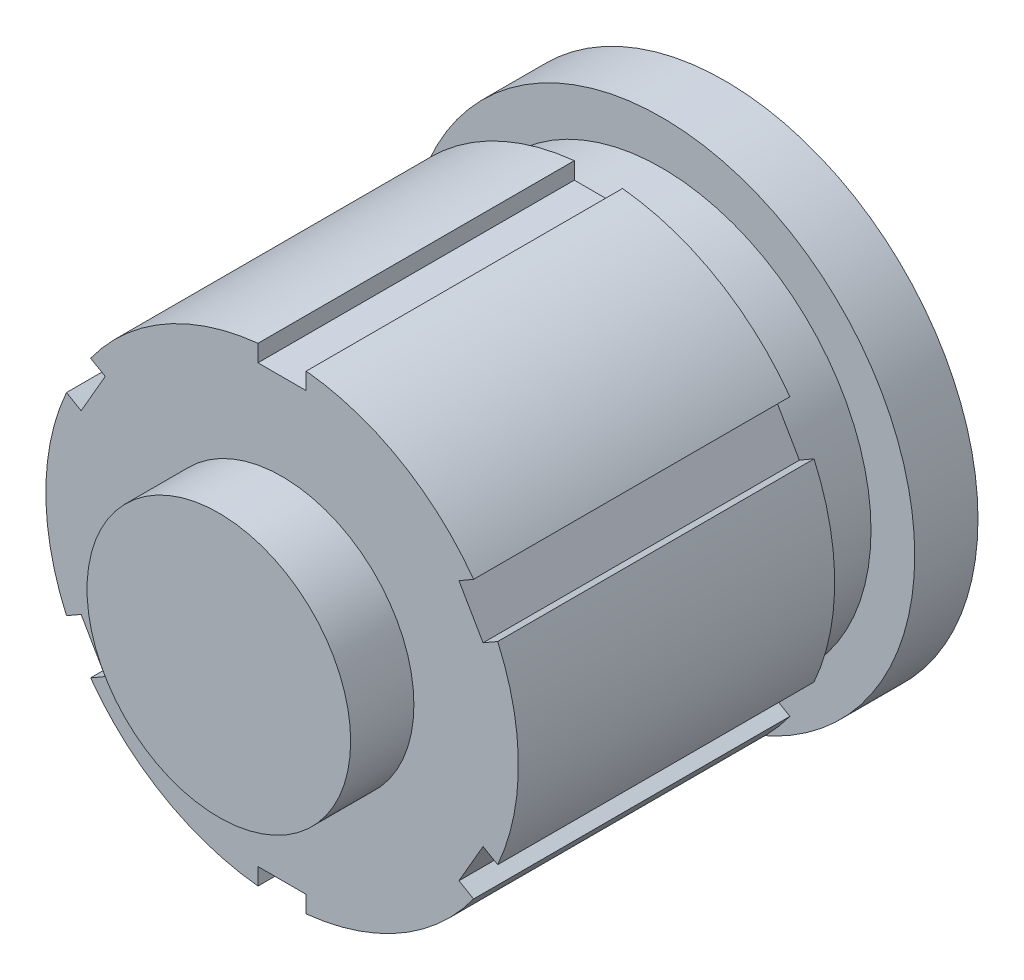
ISO-10303-21;
HEADER;
FILE_DESCRIPTION(('STEP AP214'),'2;1');
FILE_NAME('part.step','',(''),(''),'','','');
FILE_SCHEMA(('AUTOMOTIVE_DESIGN { 1 0 10303 214 1 1 1 1 }'));
ENDSEC;
DATA;
#1=APPLICATION_CONTEXT('core data for automotive mechanical design processes');
#2=APPLICATION_PROTOCOL_DEFINITION('international standard','automotive_design',2000,#1);
#3=PRODUCT_CONTEXT('',#1,'mechanical');
#4=PRODUCT('Part','Part','',(#3));
#5=PRODUCT_RELATED_PRODUCT_CATEGORY('part','',(#4));
#6=PRODUCT_DEFINITION_FORMATION('','',#4);
#7=PRODUCT_DEFINITION_CONTEXT('part definition',#1,'design');
#8=PRODUCT_DEFINITION('design','',#6,#7);
#9=PRODUCT_DEFINITION_SHAPE('','',#8);
#10=(LENGTH_UNIT() NAMED_UNIT(*) SI_UNIT(.MILLI.,.METRE.));
#11=(NAMED_UNIT(*) PLANE_ANGLE_UNIT() SI_UNIT($,.RADIAN.));
#12=(NAMED_UNIT(*) SI_UNIT($,.STERADIAN.) SOLID_ANGLE_UNIT());
#13=UNCERTAINTY_MEASURE_WITH_UNIT(LENGTH_MEASURE(1.E-05),#10,'distance_accuracy_value','');
#14=(GEOMETRIC_REPRESENTATION_CONTEXT(3) GLOBAL_UNCERTAINTY_ASSIGNED_CONTEXT((#13)) GLOBAL_UNIT_ASSIGNED_CONTEXT((#10,
#11,#12)) REPRESENTATION_CONTEXT('',''));
#15=CARTESIAN_POINT('',(0.,0.,0.));
#16=DIRECTION('',(0.,0.,1.));
#17=DIRECTION('',(1.,0.,0.));
#18=AXIS2_PLACEMENT_3D('',#15,#16,#17);
#19=CARTESIAN_POINT('',(0.,0.,35.));
#20=DIRECTION('',(0.,0.,1.));
#21=DIRECTION('',(1.,0.,0.));
#22=AXIS2_PLACEMENT_3D('',#19,#20,#21);
#23=PLANE('',#22);
#24=DIRECTION('',(0.866025403784439,-0.5,0.));
#25=VECTOR('',#24,1.);
#26=CARTESIAN_POINT('',(-0.952737771685016,-1.6501902268484,35.));
#27=LINE('',#26,#25);
#28=CARTESIAN_POINT('',(-17.0402573948478,7.63794355817802,35.));
#29=VERTEX_POINT('',#28);
#30=CARTESIAN_POINT('',(-15.8830303002571,6.96981818360254,35.));
#31=VERTEX_POINT('',#30);
#32=EDGE_CURVE('E11',#29,#31,#27,.T.);
#33=ORIENTED_EDGE('',*,*,#32,.F.);
#34=CARTESIAN_POINT('',(0.,0.,35.));
#35=DIRECTION('',(0.,0.,1.));
#36=DIRECTION('',(1.,0.,0.));
#37=AXIS2_PLACEMENT_3D('',#34,#35,#36);
#38=CIRCLE('',#37,18.6737396865378);
#39=CARTESIAN_POINT('',(-17.0402573948434,-7.63794355818781,35.));
#40=VERTEX_POINT('',#39);
#41=EDGE_CURVE('E365',#29,#40,#38,.T.);
#42=ORIENTED_EDGE('',*,*,#41,.T.);
#43=DIRECTION('',(-0.866025403784439,-0.5,0.));
#44=VECTOR('',#43,1.);
#45=CARTESIAN_POINT('',(-18.3663111475,-8.40354104924404,35.));
#46=LINE('',#45,#44);
#47=CARTESIAN_POINT('',(-15.8830303002522,-6.96981818361205,35.));
#48=VERTEX_POINT('',#47);
#49=EDGE_CURVE('E237',#48,#40,#46,.T.);
#50=ORIENTED_EDGE('',*,*,#49,.F.);
#51=DIRECTION('',(-0.5,0.866025403784438,0.));
#52=VECTOR('',#51,1.);
#53=CARTESIAN_POINT('',(-13.9775547568851,-10.2701986373038,35.));
#54=LINE('',#53,#52);
#55=CARTESIAN_POINT('',(-13.9775547568851,-10.2701986373038,35.));
#56=VERTEX_POINT('',#55);
#57=EDGE_CURVE('E58',#56,#48,#54,.T.);
#58=ORIENTED_EDGE('',*,*,#57,.F.);
#59=DIRECTION('',(0.866025403784439,0.5,0.));
#60=VECTOR('',#59,1.);
#61=CARTESIAN_POINT('',(0.952737771687454,-1.65019022685263,35.));
#62=LINE('',#61,#60);
#63=CARTESIAN_POINT('',(-15.1347818514749,-10.9383240118788,35.));
#64=VERTEX_POINT('',#63);
#65=EDGE_CURVE('E43',#64,#56,#62,.T.);
#66=ORIENTED_EDGE('',*,*,#65,.F.);
#67=CARTESIAN_POINT('',(-1.90547554335738,-18.5762675700541,35.));
#68=VERTEX_POINT('',#67);
#69=EDGE_CURVE('E438',#64,#68,#38,.T.);
#70=ORIENTED_EDGE('',*,*,#69,.T.);
#71=DIRECTION('',(0.,-1.,0.));
#72=VECTOR('',#71,1.);
#73=CARTESIAN_POINT('',(-1.90547554335738,-20.1074625521709,35.));
#74=LINE('',#73,#72);
#75=CARTESIAN_POINT('',(-1.90547554335738,-17.2400168209069,35.));
#76=VERTEX_POINT('',#75);
#77=EDGE_CURVE('E261',#76,#68,#74,.T.);
#78=ORIENTED_EDGE('',*,*,#77,.F.);
#79=DIRECTION('',(-1.,0.,0.));
#80=VECTOR('',#79,1.);
#81=CARTESIAN_POINT('',(1.90547554337688,-17.2400168209069,35.));
#82=LINE('',#81,#80);
#83=CARTESIAN_POINT('',(1.90547554337688,-17.2400168209069,35.));
#84=VERTEX_POINT('',#83);
#85=EDGE_CURVE('E256',#84,#76,#82,.T.);
#86=ORIENTED_EDGE('',*,*,#85,.F.);
#87=DIRECTION('',(0.,1.,0.));
#88=VECTOR('',#87,1.);
#89=CARTESIAN_POINT('',(1.90547554337689,0.,35.));
#90=LINE('',#89,#88);
#91=CARTESIAN_POINT('',(1.90547554337687,-18.5762675700521,35.));
#92=VERTEX_POINT('',#91);
#93=EDGE_CURVE('E387',#92,#84,#90,.T.);
#94=ORIENTED_EDGE('',*,*,#93,.F.);
#95=CARTESIAN_POINT('',(15.1347818514835,-10.9383240118669,35.));
#96=VERTEX_POINT('',#95);
#97=EDGE_CURVE('E434',#92,#96,#38,.T.);
#98=ORIENTED_EDGE('',*,*,#97,.T.);
#99=DIRECTION('',(0.866025403784439,-0.5,0.));
#100=VECTOR('',#99,1.);
#101=CARTESIAN_POINT('',(16.4608356041476,-11.7039215029274,35.));
#102=LINE('',#101,#100);
#103=CARTESIAN_POINT('',(13.9775547568997,-10.2701986372954,35.));
#104=VERTEX_POINT('',#103);
#105=EDGE_CURVE('E287',#104,#96,#102,.T.);
#106=ORIENTED_EDGE('',*,*,#105,.F.);
#107=DIRECTION('',(-0.5,-0.866025403784439,0.));
#108=VECTOR('',#107,1.);
#109=CARTESIAN_POINT('',(15.8830303002668,-6.96981818360361,35.));
#110=LINE('',#109,#108);
#111=CARTESIAN_POINT('',(15.8830303002668,-6.96981818360361,35.));
#112=VERTEX_POINT('',#111);
#113=EDGE_CURVE('E282',#112,#104,#110,.T.);
#114=ORIENTED_EDGE('',*,*,#113,.F.);
#115=DIRECTION('',(-0.866025403784438,0.5,0.));
#116=VECTOR('',#115,1.);
#117=CARTESIAN_POINT('',(0.952737771686994,1.65019022685183,35.));
#118=LINE('',#117,#116);
#119=CARTESIAN_POINT('',(17.0402573948494,-7.6379435581744,35.));
#120=VERTEX_POINT('',#119);
#121=EDGE_CURVE('E385',#120,#112,#118,.T.);
#122=ORIENTED_EDGE('',*,*,#121,.F.);
#123=CARTESIAN_POINT('',(17.0402573948458,7.63794355818249,35.));
#124=VERTEX_POINT('',#123);
#125=EDGE_CURVE('E433',#120,#124,#38,.T.);
#126=ORIENTED_EDGE('',*,*,#125,.T.);
#127=DIRECTION('',(0.866025403784439,0.5,0.));
#128=VECTOR('',#127,1.);
#129=CARTESIAN_POINT('',(18.3663111475098,8.40354104924297,35.));
#130=LINE('',#129,#128);
#131=CARTESIAN_POINT('',(15.883030300262,6.96981818361099,35.));
#132=VERTEX_POINT('',#131);
#133=EDGE_CURVE('E313',#132,#124,#130,.T.);
#134=ORIENTED_EDGE('',*,*,#133,.F.);
#135=DIRECTION('',(0.5,-0.866025403784439,0.));
#136=VECTOR('',#135,1.);
#137=CARTESIAN_POINT('',(13.9775547568948,10.2701986373028,35.));
#138=LINE('',#137,#136);
#139=CARTESIAN_POINT('',(13.9775547568948,10.2701986373028,35.));
#140=VERTEX_POINT('',#139);
#141=EDGE_CURVE('E308',#140,#132,#138,.T.);
#142=ORIENTED_EDGE('',*,*,#141,.F.);
#143=DIRECTION('',(-0.866025403784439,-0.5,0.));
#144=VECTOR('',#143,1.);
#145=CARTESIAN_POINT('',(-0.952737771684548,1.65019022684759,35.));
#146=LINE('',#145,#144);
#147=CARTESIAN_POINT('',(15.1347818514783,10.9383240118741,35.));
#148=VERTEX_POINT('',#147);
#149=EDGE_CURVE('E383',#148,#140,#146,.T.);
#150=ORIENTED_EDGE('',*,*,#149,.F.);
#151=CARTESIAN_POINT('',(1.90547554336714,18.5762675700531,35.));
#152=VERTEX_POINT('',#151);
#153=EDGE_CURVE('E366',#148,#152,#38,.T.);
#154=ORIENTED_EDGE('',*,*,#153,.T.);
#155=DIRECTION('',(0.,1.,0.));
#156=VECTOR('',#155,1.);
#157=CARTESIAN_POINT('',(1.90547554336714,20.1074625521698,35.));
#158=LINE('',#157,#156);
#159=CARTESIAN_POINT('',(1.90547554336714,17.2400168209058,35.));
#160=VERTEX_POINT('',#159);
#161=EDGE_CURVE('E334',#160,#152,#158,.T.);
#162=ORIENTED_EDGE('',*,*,#161,.F.);
#163=DIRECTION('',(1.,0.,0.));
#164=VECTOR('',#163,1.);
#165=CARTESIAN_POINT('',(-1.90547554336711,17.2400168209058,35.));
#166=LINE('',#165,#164);
#167=CARTESIAN_POINT('',(-1.90547554336711,17.2400168209058,35.));
#168=VERTEX_POINT('',#167);
#169=EDGE_CURVE('E339',#168,#160,#166,.T.);
#170=ORIENTED_EDGE('',*,*,#169,.F.);
#171=DIRECTION('',(0.,-1.,0.));
#172=VECTOR('',#171,1.);
#173=CARTESIAN_POINT('',(-1.90547554336713,0.,35.));
#174=LINE('',#173,#172);
#175=CARTESIAN_POINT('',(-1.90547554336711,18.5762675700531,35.));
#176=VERTEX_POINT('',#175);
#177=EDGE_CURVE('E379',#176,#168,#174,.T.);
#178=ORIENTED_EDGE('',*,*,#177,.F.);
#179=CARTESIAN_POINT('',(-15.1347818514812,10.9383240118701,35.));
#180=VERTEX_POINT('',#179);
#181=EDGE_CURVE('E361',#176,#180,#38,.T.);
#182=ORIENTED_EDGE('',*,*,#181,.T.);
#183=DIRECTION('',(-0.866025403784439,0.5,0.));
#184=VECTOR('',#183,1.);
#185=CARTESIAN_POINT('',(-16.4608356041378,11.7039215029263,35.));
#186=LINE('',#185,#184);
#187=CARTESIAN_POINT('',(-13.97755475689,10.2701986372943,35.));
#188=VERTEX_POINT('',#187);
#189=EDGE_CURVE('E218',#188,#180,#186,.T.);
#190=ORIENTED_EDGE('',*,*,#189,.F.);
#191=DIRECTION('',(0.5,0.866025403784439,0.));
#192=VECTOR('',#191,1.);
#193=CARTESIAN_POINT('',(-15.8830303002571,6.96981818360254,35.));
#194=LINE('',#193,#192);
#195=EDGE_CURVE('E50',#31,#188,#194,.T.);
#196=ORIENTED_EDGE('',*,*,#195,.F.);
#197=EDGE_LOOP('',(#33,#42,#50,#58,#66,#70,#78,#86,#94,#98,#106,#114,#122,#126,#134,#142,#150,
#154,#162,#170,#178,#182,#190,#196));
#198=FACE_BOUND('',#197,.T.);
#199=CARTESIAN_POINT('',(0.,0.,35.));
#200=DIRECTION('',(0.,0.,1.));
#201=DIRECTION('',(1.,0.,0.));
#202=AXIS2_PLACEMENT_3D('',#199,#200,#201);
#203=CIRCLE('',#202,10.4173741918093);
#204=CARTESIAN_POINT('',(10.4173741918093,0.,35.));
#205=VERTEX_POINT('',#204);
#206=EDGE_CURVE('E222',#205,#205,#203,.T.);
#207=ORIENTED_EDGE('',*,*,#206,.F.);
#208=EDGE_LOOP('',(#207));
#209=FACE_BOUND('',#208,.T.);
#210=ADVANCED_FACE('F35',(#198,#209),#23,.T.);
#211=CARTESIAN_POINT('',(0.,0.,35.));
#212=DIRECTION('',(0.,0.,-1.));
#213=DIRECTION('',(-1.,0.,0.));
#214=AXIS2_PLACEMENT_3D('',#211,#212,#213);
#215=CYLINDRICAL_SURFACE('',#214,18.6737396865378);
#216=ORIENTED_EDGE('',*,*,#41,.F.);
#217=DIRECTION('',(0.,0.,-1.));
#218=VECTOR('',#217,1.);
#219=CARTESIAN_POINT('',(-17.0402573948478,7.63794355817802,35.));
#220=LINE('',#219,#218);
#221=CARTESIAN_POINT('',(-17.0402573948478,7.63794355817802,10.));
#222=VERTEX_POINT('',#221);
#223=EDGE_CURVE('E230',#29,#222,#220,.T.);
#224=ORIENTED_EDGE('',*,*,#223,.T.);
#225=CARTESIAN_POINT('',(0.,0.,10.));
#226=DIRECTION('',(0.,0.,1.));
#227=DIRECTION('',(1.,0.,0.));
#228=AXIS2_PLACEMENT_3D('',#225,#226,#227);
#229=CIRCLE('',#228,18.6737396865378);
#230=CARTESIAN_POINT('',(-17.0402573948434,-7.63794355818782,10.));
#231=VERTEX_POINT('',#230);
#232=EDGE_CURVE('E369',#222,#231,#229,.T.);
#233=ORIENTED_EDGE('',*,*,#232,.T.);
#234=DIRECTION('',(0.,0.,-1.));
#235=VECTOR('',#234,1.);
#236=CARTESIAN_POINT('',(-17.0402573948434,-7.63794355818782,35.));
#237=LINE('',#236,#235);
#238=EDGE_CURVE('E249',#231,#40,#237,.F.);
#239=ORIENTED_EDGE('',*,*,#238,.T.);
#240=EDGE_LOOP('',(#216,#224,#233,#239));
#241=FACE_BOUND('',#240,.T.);
#242=ADVANCED_FACE('F404',(#241),#215,.T.);
#243=ORIENTED_EDGE('',*,*,#69,.F.);
#244=DIRECTION('',(0.,0.,-1.));
#245=VECTOR('',#244,1.);
#246=CARTESIAN_POINT('',(-15.1347818514749,-10.9383240118788,35.));
#247=LINE('',#246,#245);
#248=CARTESIAN_POINT('',(-15.1347818514749,-10.9383240118788,10.));
#249=VERTEX_POINT('',#248);
#250=EDGE_CURVE('E253',#64,#249,#247,.T.);
#251=ORIENTED_EDGE('',*,*,#250,.T.);
#252=CARTESIAN_POINT('',(-1.90547554335738,-18.5762675700541,10.));
#253=VERTEX_POINT('',#252);
#254=EDGE_CURVE('E405',#249,#253,#229,.T.);
#255=ORIENTED_EDGE('',*,*,#254,.T.);
#256=DIRECTION('',(0.,0.,-1.));
#257=VECTOR('',#256,1.);
#258=CARTESIAN_POINT('',(-1.90547554335738,-18.5762675700541,35.));
#259=LINE('',#258,#257);
#260=EDGE_CURVE('E274',#253,#68,#259,.F.);
#261=ORIENTED_EDGE('',*,*,#260,.T.);
#262=EDGE_LOOP('',(#243,#251,#255,#261));
#263=FACE_BOUND('',#262,.T.);
#264=ADVANCED_FACE('F447',(#263),#215,.T.);
#265=ORIENTED_EDGE('',*,*,#97,.F.);
#266=DIRECTION('',(0.,0.,-1.));
#267=VECTOR('',#266,1.);
#268=CARTESIAN_POINT('',(1.90547554337687,-18.5762675700521,35.));
#269=LINE('',#268,#267);
#270=CARTESIAN_POINT('',(1.90547554337687,-18.5762675700521,10.));
#271=VERTEX_POINT('',#270);
#272=EDGE_CURVE('E279',#92,#271,#269,.T.);
#273=ORIENTED_EDGE('',*,*,#272,.T.);
#274=CARTESIAN_POINT('',(15.1347818514835,-10.9383240118669,10.));
#275=VERTEX_POINT('',#274);
#276=EDGE_CURVE('E406',#271,#275,#229,.T.);
#277=ORIENTED_EDGE('',*,*,#276,.T.);
#278=DIRECTION('',(0.,0.,-1.));
#279=VECTOR('',#278,1.);
#280=CARTESIAN_POINT('',(15.1347818514835,-10.9383240118669,35.));
#281=LINE('',#280,#279);
#282=EDGE_CURVE('E300',#275,#96,#281,.F.);
#283=ORIENTED_EDGE('',*,*,#282,.T.);
#284=EDGE_LOOP('',(#265,#273,#277,#283));
#285=FACE_BOUND('',#284,.T.);
#286=ADVANCED_FACE('F449',(#285),#215,.T.);
#287=ORIENTED_EDGE('',*,*,#125,.F.);
#288=DIRECTION('',(0.,0.,-1.));
#289=VECTOR('',#288,1.);
#290=CARTESIAN_POINT('',(17.0402573948494,-7.6379435581744,35.));
#291=LINE('',#290,#289);
#292=CARTESIAN_POINT('',(17.0402573948494,-7.6379435581744,10.));
#293=VERTEX_POINT('',#292);
#294=EDGE_CURVE('E305',#120,#293,#291,.T.);
#295=ORIENTED_EDGE('',*,*,#294,.T.);
#296=CARTESIAN_POINT('',(17.0402573948458,7.63794355818249,10.));
#297=VERTEX_POINT('',#296);
#298=EDGE_CURVE('E410',#293,#297,#229,.T.);
#299=ORIENTED_EDGE('',*,*,#298,.T.);
#300=DIRECTION('',(0.,0.,-1.));
#301=VECTOR('',#300,1.);
#302=CARTESIAN_POINT('',(17.0402573948458,7.63794355818249,35.));
#303=LINE('',#302,#301);
#304=EDGE_CURVE('E326',#297,#124,#303,.F.);
#305=ORIENTED_EDGE('',*,*,#304,.T.);
#306=EDGE_LOOP('',(#287,#295,#299,#305));
#307=FACE_BOUND('',#306,.T.);
#308=ADVANCED_FACE('F455',(#307),#215,.T.);
#309=ORIENTED_EDGE('',*,*,#153,.F.);
#310=DIRECTION('',(0.,0.,-1.));
#311=VECTOR('',#310,1.);
#312=CARTESIAN_POINT('',(15.1347818514783,10.9383240118741,35.));
#313=LINE('',#312,#311);
#314=CARTESIAN_POINT('',(15.1347818514783,10.9383240118741,10.));
#315=VERTEX_POINT('',#314);
#316=EDGE_CURVE('E331',#148,#315,#313,.T.);
#317=ORIENTED_EDGE('',*,*,#316,.T.);
#318=CARTESIAN_POINT('',(1.90547554336714,18.5762675700531,10.));
#319=VERTEX_POINT('',#318);
#320=EDGE_CURVE('E360',#315,#319,#229,.T.);
#321=ORIENTED_EDGE('',*,*,#320,.T.);
#322=DIRECTION('',(0.,0.,-1.));
#323=VECTOR('',#322,1.);
#324=CARTESIAN_POINT('',(1.90547554336714,18.5762675700531,35.));
#325=LINE('',#324,#323);
#326=EDGE_CURVE('E357',#319,#152,#325,.F.);
#327=ORIENTED_EDGE('',*,*,#326,.T.);
#328=EDGE_LOOP('',(#309,#317,#321,#327));
#329=FACE_BOUND('',#328,.T.);
#330=ADVANCED_FACE('F421',(#329),#215,.T.);
#331=CARTESIAN_POINT('',(0.,0.,5.));
#332=DIRECTION('',(0.,0.,1.));
#333=DIRECTION('',(1.,0.,0.));
#334=AXIS2_PLACEMENT_3D('',#331,#332,#333);
#335=PLANE('',#334);
#336=CARTESIAN_POINT('',(0.,0.,5.));
#337=DIRECTION('',(0.,0.,1.));
#338=DIRECTION('',(1.,0.,0.));
#339=AXIS2_PLACEMENT_3D('',#336,#337,#338);
#340=CIRCLE('',#339,20.);
#341=CARTESIAN_POINT('',(20.,0.,5.));
#342=VERTEX_POINT('',#341);
#343=EDGE_CURVE('E376',#342,#342,#340,.T.);
#344=ORIENTED_EDGE('',*,*,#343,.T.);
#345=EDGE_LOOP('',(#344));
#346=FACE_BOUND('',#345,.T.);
#347=CARTESIAN_POINT('',(0.,0.,5.));
#348=DIRECTION('',(0.,0.,1.));
#349=DIRECTION('',(1.,0.,0.));
#350=AXIS2_PLACEMENT_3D('',#347,#348,#349);
#351=CIRCLE('',#350,16.5442564316283);
#352=CARTESIAN_POINT('',(16.5442564316283,0.,5.));
#353=VERTEX_POINT('',#352);
#354=EDGE_CURVE('E364',#353,#353,#351,.T.);
#355=ORIENTED_EDGE('',*,*,#354,.F.);
#356=EDGE_LOOP('',(#355));
#357=FACE_BOUND('',#356,.T.);
#358=ADVANCED_FACE('F483',(#346,#357),#335,.T.);
#359=CARTESIAN_POINT('',(0.,0.,5.));
#360=DIRECTION('',(0.,0.,-1.));
#361=DIRECTION('',(-1.,0.,0.));
#362=AXIS2_PLACEMENT_3D('',#359,#360,#361);
#363=CYLINDRICAL_SURFACE('',#362,20.);
#364=ORIENTED_EDGE('',*,*,#343,.F.);
#365=EDGE_LOOP('',(#364));
#366=FACE_BOUND('',#365,.T.);
#367=CARTESIAN_POINT('',(0.,0.,0.));
#368=DIRECTION('',(0.,0.,1.));
#369=DIRECTION('',(1.,0.,0.));
#370=AXIS2_PLACEMENT_3D('',#367,#368,#369);
#371=CIRCLE('',#370,20.);
#372=CARTESIAN_POINT('',(20.,0.,0.));
#373=VERTEX_POINT('',#372);
#374=EDGE_CURVE('E373',#373,#373,#371,.T.);
#375=ORIENTED_EDGE('',*,*,#374,.T.);
#376=EDGE_LOOP('',(#375));
#377=FACE_BOUND('',#376,.T.);
#378=ADVANCED_FACE('F37',(#366,#377),#363,.T.);
#379=CARTESIAN_POINT('',(0.,0.,0.));
#380=DIRECTION('',(0.,0.,1.));
#381=DIRECTION('',(1.,0.,0.));
#382=AXIS2_PLACEMENT_3D('',#379,#380,#381);
#383=PLANE('',#382);
#384=ORIENTED_EDGE('',*,*,#374,.F.);
#385=EDGE_LOOP('',(#384));
#386=FACE_BOUND('',#385,.T.);
#387=ADVANCED_FACE('F474',(#386),#383,.F.);
#388=CARTESIAN_POINT('',(0.,0.,10.));
#389=DIRECTION('',(0.,0.,-1.));
#390=DIRECTION('',(-1.,0.,0.));
#391=AXIS2_PLACEMENT_3D('',#388,#389,#390);
#392=CYLINDRICAL_SURFACE('',#391,16.5442564316283);
#393=CARTESIAN_POINT('',(0.,0.,10.));
#394=DIRECTION('',(0.,0.,1.));
#395=DIRECTION('',(1.,0.,0.));
#396=AXIS2_PLACEMENT_3D('',#393,#394,#395);
#397=CIRCLE('',#396,16.5442564316283);
#398=CARTESIAN_POINT('',(16.5442564316283,0.,10.));
#399=VERTEX_POINT('',#398);
#400=EDGE_CURVE('E370',#399,#399,#397,.T.);
#401=ORIENTED_EDGE('',*,*,#400,.F.);
#402=EDGE_LOOP('',(#401));
#403=FACE_BOUND('',#402,.T.);
#404=ORIENTED_EDGE('',*,*,#354,.T.);
#405=EDGE_LOOP('',(#404));
#406=FACE_BOUND('',#405,.T.);
#407=ADVANCED_FACE('F468',(#403,#406),#392,.T.);
#408=CARTESIAN_POINT('',(0.,0.,10.));
#409=DIRECTION('',(0.,0.,1.));
#410=DIRECTION('',(1.,0.,0.));
#411=AXIS2_PLACEMENT_3D('',#408,#409,#410);
#412=PLANE('',#411);
#413=ORIENTED_EDGE('',*,*,#232,.F.);
#414=DIRECTION('',(0.866025403784439,-0.5,0.));
#415=VECTOR('',#414,1.);
#416=CARTESIAN_POINT('',(-18.3663111475049,8.40354104923452,10.));
#417=LINE('',#416,#415);
#418=CARTESIAN_POINT('',(-15.8830303002571,6.96981818360254,10.));
#419=VERTEX_POINT('',#418);
#420=EDGE_CURVE('E204',#222,#419,#417,.T.);
#421=ORIENTED_EDGE('',*,*,#420,.T.);
#422=DIRECTION('',(0.5,0.866025403784439,0.));
#423=VECTOR('',#422,1.);
#424=CARTESIAN_POINT('',(-15.8830303002571,6.96981818360254,10.));
#425=LINE('',#424,#423);
#426=CARTESIAN_POINT('',(-13.97755475689,10.2701986372943,10.));
#427=VERTEX_POINT('',#426);
#428=EDGE_CURVE('E199',#419,#427,#425,.T.);
#429=ORIENTED_EDGE('',*,*,#428,.T.);
#430=DIRECTION('',(-0.866025403784439,0.5,0.));
#431=VECTOR('',#430,1.);
#432=CARTESIAN_POINT('',(-16.4608356041378,11.7039215029263,10.));
#433=LINE('',#432,#431);
#434=CARTESIAN_POINT('',(-15.1347818514812,10.9383240118701,10.));
#435=VERTEX_POINT('',#434);
#436=EDGE_CURVE('E207',#427,#435,#433,.T.);
#437=ORIENTED_EDGE('',*,*,#436,.T.);
#438=CARTESIAN_POINT('',(-1.90547554336711,18.5762675700531,10.));
#439=VERTEX_POINT('',#438);
#440=EDGE_CURVE('E367',#439,#435,#229,.T.);
#441=ORIENTED_EDGE('',*,*,#440,.F.);
#442=DIRECTION('',(0.,-1.,0.));
#443=VECTOR('',#442,1.);
#444=CARTESIAN_POINT('',(-1.90547554336711,20.1074625521698,10.));
#445=LINE('',#444,#443);
#446=CARTESIAN_POINT('',(-1.90547554336711,17.2400168209058,10.));
#447=VERTEX_POINT('',#446);
#448=EDGE_CURVE('E338',#439,#447,#445,.T.);
#449=ORIENTED_EDGE('',*,*,#448,.T.);
#450=DIRECTION('',(1.,0.,0.));
#451=VECTOR('',#450,1.);
#452=CARTESIAN_POINT('',(-1.90547554336711,17.2400168209058,10.));
#453=LINE('',#452,#451);
#454=CARTESIAN_POINT('',(1.90547554336714,17.2400168209058,10.));
#455=VERTEX_POINT('',#454);
#456=EDGE_CURVE('E342',#447,#455,#453,.T.);
#457=ORIENTED_EDGE('',*,*,#456,.T.);
#458=DIRECTION('',(0.,1.,0.));
#459=VECTOR('',#458,1.);
#460=CARTESIAN_POINT('',(1.90547554336714,20.1074625521698,10.));
#461=LINE('',#460,#459);
#462=EDGE_CURVE('E335',#455,#319,#461,.T.);
#463=ORIENTED_EDGE('',*,*,#462,.T.);
#464=ORIENTED_EDGE('',*,*,#320,.F.);
#465=DIRECTION('',(-0.866025403784439,-0.5,0.));
#466=VECTOR('',#465,1.);
#467=CARTESIAN_POINT('',(16.4608356041427,11.7039215029347,10.));
#468=LINE('',#467,#466);
#469=CARTESIAN_POINT('',(13.9775547568948,10.2701986373028,10.));
#470=VERTEX_POINT('',#469);
#471=EDGE_CURVE('E316',#315,#470,#468,.T.);
#472=ORIENTED_EDGE('',*,*,#471,.T.);
#473=DIRECTION('',(0.5,-0.866025403784439,0.));
#474=VECTOR('',#473,1.);
#475=CARTESIAN_POINT('',(13.9775547568948,10.2701986373028,10.));
#476=LINE('',#475,#474);
#477=CARTESIAN_POINT('',(15.883030300262,6.96981818361099,10.));
#478=VERTEX_POINT('',#477);
#479=EDGE_CURVE('E309',#470,#478,#476,.T.);
#480=ORIENTED_EDGE('',*,*,#479,.T.);
#481=DIRECTION('',(0.866025403784439,0.5,0.));
#482=VECTOR('',#481,1.);
#483=CARTESIAN_POINT('',(18.3663111475098,8.40354104924297,10.));
#484=LINE('',#483,#482);
#485=EDGE_CURVE('E312',#478,#297,#484,.T.);
#486=ORIENTED_EDGE('',*,*,#485,.T.);
#487=ORIENTED_EDGE('',*,*,#298,.F.);
#488=DIRECTION('',(-0.866025403784438,0.500000000000001,0.));
#489=VECTOR('',#488,1.);
#490=CARTESIAN_POINT('',(18.3663111475147,-8.4035410492356,10.));
#491=LINE('',#490,#489);
#492=CARTESIAN_POINT('',(15.8830303002668,-6.96981818360361,10.));
#493=VERTEX_POINT('',#492);
#494=EDGE_CURVE('E290',#293,#493,#491,.T.);
#495=ORIENTED_EDGE('',*,*,#494,.T.);
#496=DIRECTION('',(-0.5,-0.866025403784439,0.));
#497=VECTOR('',#496,1.);
#498=CARTESIAN_POINT('',(15.8830303002668,-6.96981818360361,10.));
#499=LINE('',#498,#497);
#500=CARTESIAN_POINT('',(13.9775547568997,-10.2701986372954,10.));
#501=VERTEX_POINT('',#500);
#502=EDGE_CURVE('E283',#493,#501,#499,.T.);
#503=ORIENTED_EDGE('',*,*,#502,.T.);
#504=DIRECTION('',(0.866025403784439,-0.5,0.));
#505=VECTOR('',#504,1.);
#506=CARTESIAN_POINT('',(16.4608356041476,-11.7039215029274,10.));
#507=LINE('',#506,#505);
#508=EDGE_CURVE('E286',#501,#275,#507,.T.);
#509=ORIENTED_EDGE('',*,*,#508,.T.);
#510=ORIENTED_EDGE('',*,*,#276,.F.);
#511=DIRECTION('',(0.,1.,0.));
#512=VECTOR('',#511,1.);
#513=CARTESIAN_POINT('',(1.90547554337687,-20.1074625521709,10.));
#514=LINE('',#513,#512);
#515=CARTESIAN_POINT('',(1.90547554337688,-17.2400168209069,10.));
#516=VERTEX_POINT('',#515);
#517=EDGE_CURVE('E264',#271,#516,#514,.T.);
#518=ORIENTED_EDGE('',*,*,#517,.T.);
#519=DIRECTION('',(-1.,0.,0.));
#520=VECTOR('',#519,1.);
#521=CARTESIAN_POINT('',(1.90547554337688,-17.2400168209069,10.));
#522=LINE('',#521,#520);
#523=CARTESIAN_POINT('',(-1.90547554335738,-17.2400168209069,10.));
#524=VERTEX_POINT('',#523);
#525=EDGE_CURVE('E257',#516,#524,#522,.T.);
#526=ORIENTED_EDGE('',*,*,#525,.T.);
#527=DIRECTION('',(0.,-1.,0.));
#528=VECTOR('',#527,1.);
#529=CARTESIAN_POINT('',(-1.90547554335738,-20.1074625521709,10.));
#530=LINE('',#529,#528);
#531=EDGE_CURVE('E260',#524,#253,#530,.T.);
#532=ORIENTED_EDGE('',*,*,#531,.T.);
#533=ORIENTED_EDGE('',*,*,#254,.F.);
#534=DIRECTION('',(0.866025403784439,0.5,0.));
#535=VECTOR('',#534,1.);
#536=CARTESIAN_POINT('',(-16.4608356041329,-11.7039215029358,10.));
#537=LINE('',#536,#535);
#538=CARTESIAN_POINT('',(-13.9775547568851,-10.2701986373038,10.));
#539=VERTEX_POINT('',#538);
#540=EDGE_CURVE('E240',#249,#539,#537,.T.);
#541=ORIENTED_EDGE('',*,*,#540,.T.);
#542=DIRECTION('',(-0.5,0.866025403784438,0.));
#543=VECTOR('',#542,1.);
#544=CARTESIAN_POINT('',(-13.9775547568851,-10.2701986373038,10.));
#545=LINE('',#544,#543);
#546=CARTESIAN_POINT('',(-15.8830303002522,-6.96981818361205,10.));
#547=VERTEX_POINT('',#546);
#548=EDGE_CURVE('E233',#539,#547,#545,.T.);
#549=ORIENTED_EDGE('',*,*,#548,.T.);
#550=DIRECTION('',(-0.866025403784439,-0.5,0.));
#551=VECTOR('',#550,1.);
#552=CARTESIAN_POINT('',(-18.3663111475,-8.40354104924404,10.));
#553=LINE('',#552,#551);
#554=EDGE_CURVE('E236',#547,#231,#553,.T.);
#555=ORIENTED_EDGE('',*,*,#554,.T.);
#556=EDGE_LOOP('',(#413,#421,#429,#437,#441,#449,#457,#463,#464,#472,#480,#486,#487,#495,#503,
#509,#510,#518,#526,#532,#533,#541,#549,#555));
#557=FACE_BOUND('',#556,.T.);
#558=ORIENTED_EDGE('',*,*,#400,.T.);
#559=EDGE_LOOP('',(#558));
#560=FACE_BOUND('',#559,.T.);
#561=ADVANCED_FACE('F216',(#557,#560),#412,.F.);
#562=ORIENTED_EDGE('',*,*,#440,.T.);
#563=DIRECTION('',(0.,0.,-1.));
#564=VECTOR('',#563,1.);
#565=CARTESIAN_POINT('',(-15.1347818514812,10.9383240118701,35.));
#566=LINE('',#565,#564);
#567=EDGE_CURVE('E210',#435,#180,#566,.F.);
#568=ORIENTED_EDGE('',*,*,#567,.T.);
#569=ORIENTED_EDGE('',*,*,#181,.F.);
#570=DIRECTION('',(0.,0.,-1.));
#571=VECTOR('',#570,1.);
#572=CARTESIAN_POINT('',(-1.90547554336711,18.5762675700531,35.));
#573=LINE('',#572,#571);
#574=EDGE_CURVE('E352',#176,#439,#573,.T.);
#575=ORIENTED_EDGE('',*,*,#574,.T.);
#576=EDGE_LOOP('',(#562,#568,#569,#575));
#577=FACE_BOUND('',#576,.T.);
#578=ADVANCED_FACE('F456',(#577),#215,.T.);
#579=CARTESIAN_POINT('',(1.90547554336714,20.1074625521698,10.));
#580=DIRECTION('',(1.,0.,0.));
#581=DIRECTION('',(0.,1.,0.));
#582=AXIS2_PLACEMENT_3D('',#579,#580,#581);
#583=PLANE('',#582);
#584=ORIENTED_EDGE('',*,*,#462,.F.);
#585=DIRECTION('',(0.,0.,1.));
#586=VECTOR('',#585,1.);
#587=CARTESIAN_POINT('',(1.90547554336714,17.2400168209058,10.));
#588=LINE('',#587,#586);
#589=EDGE_CURVE('E350',#455,#160,#588,.T.);
#590=ORIENTED_EDGE('',*,*,#589,.T.);
#591=ORIENTED_EDGE('',*,*,#161,.T.);
#592=ORIENTED_EDGE('',*,*,#326,.F.);
#593=EDGE_LOOP('',(#584,#590,#591,#592));
#594=FACE_BOUND('',#593,.T.);
#595=ADVANCED_FACE('F424',(#594),#583,.F.);
#596=CARTESIAN_POINT('',(-1.90547554336711,20.1074625521698,10.));
#597=DIRECTION('',(-1.,0.,0.));
#598=DIRECTION('',(0.,-1.,0.));
#599=AXIS2_PLACEMENT_3D('',#596,#597,#598);
#600=PLANE('',#599);
#601=ORIENTED_EDGE('',*,*,#177,.T.);
#602=DIRECTION('',(0.,0.,1.));
#603=VECTOR('',#602,1.);
#604=CARTESIAN_POINT('',(-1.90547554336711,17.2400168209058,10.));
#605=LINE('',#604,#603);
#606=EDGE_CURVE('E345',#447,#168,#605,.T.);
#607=ORIENTED_EDGE('',*,*,#606,.F.);
#608=ORIENTED_EDGE('',*,*,#448,.F.);
#609=ORIENTED_EDGE('',*,*,#574,.F.);
#610=EDGE_LOOP('',(#601,#607,#608,#609));
#611=FACE_BOUND('',#610,.T.);
#612=ADVANCED_FACE('F516',(#611),#600,.F.);
#613=CARTESIAN_POINT('',(-1.90547554336711,17.2400168209058,10.));
#614=DIRECTION('',(0.,-1.,0.));
#615=DIRECTION('',(0.,0.,-1.));
#616=AXIS2_PLACEMENT_3D('',#613,#614,#615);
#617=PLANE('',#616);
#618=ORIENTED_EDGE('',*,*,#169,.T.);
#619=ORIENTED_EDGE('',*,*,#589,.F.);
#620=ORIENTED_EDGE('',*,*,#456,.F.);
#621=ORIENTED_EDGE('',*,*,#606,.T.);
#622=EDGE_LOOP('',(#618,#619,#620,#621));
#623=FACE_BOUND('',#622,.T.);
#624=ADVANCED_FACE('F428',(#623),#617,.F.);
#625=CARTESIAN_POINT('',(16.4608356041427,11.7039215029347,10.));
#626=DIRECTION('',(-0.5,0.866025403784439,0.));
#627=DIRECTION('',(-0.866025403784439,-0.5,0.));
#628=AXIS2_PLACEMENT_3D('',#625,#626,#627);
#629=PLANE('',#628);
#630=ORIENTED_EDGE('',*,*,#149,.T.);
#631=DIRECTION('',(0.,0.,1.));
#632=VECTOR('',#631,1.);
#633=CARTESIAN_POINT('',(13.9775547568948,10.2701986373028,10.));
#634=LINE('',#633,#632);
#635=EDGE_CURVE('E323',#470,#140,#634,.T.);
#636=ORIENTED_EDGE('',*,*,#635,.F.);
#637=ORIENTED_EDGE('',*,*,#471,.F.);
#638=ORIENTED_EDGE('',*,*,#316,.F.);
#639=EDGE_LOOP('',(#630,#636,#637,#638));
#640=FACE_BOUND('',#639,.T.);
#641=ADVANCED_FACE('F508',(#640),#629,.F.);
#642=CARTESIAN_POINT('',(18.3663111475098,8.40354104924297,10.));
#643=DIRECTION('',(0.5,-0.866025403784439,0.));
#644=DIRECTION('',(0.866025403784439,0.5,0.));
#645=AXIS2_PLACEMENT_3D('',#642,#643,#644);
#646=PLANE('',#645);
#647=ORIENTED_EDGE('',*,*,#485,.F.);
#648=DIRECTION('',(0.,0.,1.));
#649=VECTOR('',#648,1.);
#650=CARTESIAN_POINT('',(15.883030300262,6.96981818361099,10.));
#651=LINE('',#650,#649);
#652=EDGE_CURVE('E319',#478,#132,#651,.T.);
#653=ORIENTED_EDGE('',*,*,#652,.T.);
#654=ORIENTED_EDGE('',*,*,#133,.T.);
#655=ORIENTED_EDGE('',*,*,#304,.F.);
#656=EDGE_LOOP('',(#647,#653,#654,#655));
#657=FACE_BOUND('',#656,.T.);
#658=ADVANCED_FACE('F503',(#657),#646,.F.);
#659=CARTESIAN_POINT('',(13.9775547568948,10.2701986373028,10.));
#660=DIRECTION('',(-0.866025403784439,-0.5,0.));
#661=DIRECTION('',(0.5,-0.866025403784439,0.));
#662=AXIS2_PLACEMENT_3D('',#659,#660,#661);
#663=PLANE('',#662);
#664=ORIENTED_EDGE('',*,*,#141,.T.);
#665=ORIENTED_EDGE('',*,*,#652,.F.);
#666=ORIENTED_EDGE('',*,*,#479,.F.);
#667=ORIENTED_EDGE('',*,*,#635,.T.);
#668=EDGE_LOOP('',(#664,#665,#666,#667));
#669=FACE_BOUND('',#668,.T.);
#670=ADVANCED_FACE('F506',(#669),#663,.F.);
#671=CARTESIAN_POINT('',(18.3663111475147,-8.4035410492356,10.));
#672=DIRECTION('',(0.5,0.866025403784438,0.));
#673=DIRECTION('',(-0.866025403784438,0.5,0.));
#674=AXIS2_PLACEMENT_3D('',#671,#672,#673);
#675=PLANE('',#674);
#676=ORIENTED_EDGE('',*,*,#121,.T.);
#677=DIRECTION('',(0.,0.,1.));
#678=VECTOR('',#677,1.);
#679=CARTESIAN_POINT('',(15.8830303002668,-6.96981818360361,10.));
#680=LINE('',#679,#678);
#681=EDGE_CURVE('E297',#493,#112,#680,.T.);
#682=ORIENTED_EDGE('',*,*,#681,.F.);
#683=ORIENTED_EDGE('',*,*,#494,.F.);
#684=ORIENTED_EDGE('',*,*,#294,.F.);
#685=EDGE_LOOP('',(#676,#682,#683,#684));
#686=FACE_BOUND('',#685,.T.);
#687=ADVANCED_FACE('F523',(#686),#675,.F.);
#688=CARTESIAN_POINT('',(16.4608356041476,-11.7039215029274,10.));
#689=DIRECTION('',(-0.5,-0.866025403784439,0.));
#690=DIRECTION('',(0.866025403784439,-0.5,0.));
#691=AXIS2_PLACEMENT_3D('',#688,#689,#690);
#692=PLANE('',#691);
#693=ORIENTED_EDGE('',*,*,#508,.F.);
#694=DIRECTION('',(0.,0.,1.));
#695=VECTOR('',#694,1.);
#696=CARTESIAN_POINT('',(13.9775547568997,-10.2701986372954,10.));
#697=LINE('',#696,#695);
#698=EDGE_CURVE('E293',#501,#104,#697,.T.);
#699=ORIENTED_EDGE('',*,*,#698,.T.);
#700=ORIENTED_EDGE('',*,*,#105,.T.);
#701=ORIENTED_EDGE('',*,*,#282,.F.);
#702=EDGE_LOOP('',(#693,#699,#700,#701));
#703=FACE_BOUND('',#702,.T.);
#704=ADVANCED_FACE('F561',(#703),#692,.F.);
#705=CARTESIAN_POINT('',(15.8830303002668,-6.96981818360361,10.));
#706=DIRECTION('',(-0.866025403784439,0.5,0.));
#707=DIRECTION('',(-0.5,-0.866025403784439,0.));
#708=AXIS2_PLACEMENT_3D('',#705,#706,#707);
#709=PLANE('',#708);
#710=ORIENTED_EDGE('',*,*,#113,.T.);
#711=ORIENTED_EDGE('',*,*,#698,.F.);
#712=ORIENTED_EDGE('',*,*,#502,.F.);
#713=ORIENTED_EDGE('',*,*,#681,.T.);
#714=EDGE_LOOP('',(#710,#711,#712,#713));
#715=FACE_BOUND('',#714,.T.);
#716=ADVANCED_FACE('F519',(#715),#709,.F.);
#717=CARTESIAN_POINT('',(1.90547554337687,-20.1074625521709,10.));
#718=DIRECTION('',(1.,0.,0.));
#719=DIRECTION('',(0.,1.,0.));
#720=AXIS2_PLACEMENT_3D('',#717,#718,#719);
#721=PLANE('',#720);
#722=ORIENTED_EDGE('',*,*,#93,.T.);
#723=DIRECTION('',(0.,0.,1.));
#724=VECTOR('',#723,1.);
#725=CARTESIAN_POINT('',(1.90547554337688,-17.2400168209069,10.));
#726=LINE('',#725,#724);
#727=EDGE_CURVE('E271',#516,#84,#726,.T.);
#728=ORIENTED_EDGE('',*,*,#727,.F.);
#729=ORIENTED_EDGE('',*,*,#517,.F.);
#730=ORIENTED_EDGE('',*,*,#272,.F.);
#731=EDGE_LOOP('',(#722,#728,#729,#730));
#732=FACE_BOUND('',#731,.T.);
#733=ADVANCED_FACE('F551',(#732),#721,.F.);
#734=CARTESIAN_POINT('',(-1.90547554335738,-20.1074625521709,10.));
#735=DIRECTION('',(-1.,0.,0.));
#736=DIRECTION('',(0.,-1.,0.));
#737=AXIS2_PLACEMENT_3D('',#734,#735,#736);
#738=PLANE('',#737);
#739=ORIENTED_EDGE('',*,*,#531,.F.);
#740=DIRECTION('',(0.,0.,1.));
#741=VECTOR('',#740,1.);
#742=CARTESIAN_POINT('',(-1.90547554335738,-17.2400168209069,10.));
#743=LINE('',#742,#741);
#744=EDGE_CURVE('E267',#524,#76,#743,.T.);
#745=ORIENTED_EDGE('',*,*,#744,.T.);
#746=ORIENTED_EDGE('',*,*,#77,.T.);
#747=ORIENTED_EDGE('',*,*,#260,.F.);
#748=EDGE_LOOP('',(#739,#745,#746,#747));
#749=FACE_BOUND('',#748,.T.);
#750=ADVANCED_FACE('F446',(#749),#738,.F.);
#751=CARTESIAN_POINT('',(1.90547554337688,-17.2400168209069,10.));
#752=DIRECTION('',(0.,1.,0.));
#753=DIRECTION('',(0.,0.,1.));
#754=AXIS2_PLACEMENT_3D('',#751,#752,#753);
#755=PLANE('',#754);
#756=ORIENTED_EDGE('',*,*,#85,.T.);
#757=ORIENTED_EDGE('',*,*,#744,.F.);
#758=ORIENTED_EDGE('',*,*,#525,.F.);
#759=ORIENTED_EDGE('',*,*,#727,.T.);
#760=EDGE_LOOP('',(#756,#757,#758,#759));
#761=FACE_BOUND('',#760,.T.);
#762=ADVANCED_FACE('F548',(#761),#755,.F.);
#763=CARTESIAN_POINT('',(-16.4608356041329,-11.7039215029358,10.));
#764=DIRECTION('',(0.5,-0.866025403784439,0.));
#765=DIRECTION('',(0.866025403784439,0.5,0.));
#766=AXIS2_PLACEMENT_3D('',#763,#764,#765);
#767=PLANE('',#766);
#768=ORIENTED_EDGE('',*,*,#65,.T.);
#769=DIRECTION('',(0.,0.,1.));
#770=VECTOR('',#769,1.);
#771=CARTESIAN_POINT('',(-13.9775547568851,-10.2701986373038,10.));
#772=LINE('',#771,#770);
#773=EDGE_CURVE('E247',#539,#56,#772,.T.);
#774=ORIENTED_EDGE('',*,*,#773,.F.);
#775=ORIENTED_EDGE('',*,*,#540,.F.);
#776=ORIENTED_EDGE('',*,*,#250,.F.);
#777=EDGE_LOOP('',(#768,#774,#775,#776));
#778=FACE_BOUND('',#777,.T.);
#779=ADVANCED_FACE('F390',(#778),#767,.F.);
#780=CARTESIAN_POINT('',(-18.3663111475,-8.40354104924404,10.));
#781=DIRECTION('',(-0.5,0.866025403784439,0.));
#782=DIRECTION('',(-0.866025403784439,-0.5,0.));
#783=AXIS2_PLACEMENT_3D('',#780,#781,#782);
#784=PLANE('',#783);
#785=ORIENTED_EDGE('',*,*,#554,.F.);
#786=DIRECTION('',(0.,0.,1.));
#787=VECTOR('',#786,1.);
#788=CARTESIAN_POINT('',(-15.8830303002522,-6.96981818361205,10.));
#789=LINE('',#788,#787);
#790=EDGE_CURVE('E243',#547,#48,#789,.T.);
#791=ORIENTED_EDGE('',*,*,#790,.T.);
#792=ORIENTED_EDGE('',*,*,#49,.T.);
#793=ORIENTED_EDGE('',*,*,#238,.F.);
#794=EDGE_LOOP('',(#785,#791,#792,#793));
#795=FACE_BOUND('',#794,.T.);
#796=ADVANCED_FACE('F402',(#795),#784,.F.);
#797=CARTESIAN_POINT('',(-13.9775547568851,-10.2701986373038,10.));
#798=DIRECTION('',(0.866025403784438,0.5,0.));
#799=DIRECTION('',(-0.5,0.866025403784438,0.));
#800=AXIS2_PLACEMENT_3D('',#797,#798,#799);
#801=PLANE('',#800);
#802=ORIENTED_EDGE('',*,*,#57,.T.);
#803=ORIENTED_EDGE('',*,*,#790,.F.);
#804=ORIENTED_EDGE('',*,*,#548,.F.);
#805=ORIENTED_EDGE('',*,*,#773,.T.);
#806=EDGE_LOOP('',(#802,#803,#804,#805));
#807=FACE_BOUND('',#806,.T.);
#808=ADVANCED_FACE('F394',(#807),#801,.F.);
#809=CARTESIAN_POINT('',(-18.3663111475049,8.40354104923452,10.));
#810=DIRECTION('',(-0.5,-0.866025403784439,0.));
#811=DIRECTION('',(0.866025403784439,-0.5,0.));
#812=AXIS2_PLACEMENT_3D('',#809,#810,#811);
#813=PLANE('',#812);
#814=ORIENTED_EDGE('',*,*,#32,.T.);
#815=DIRECTION('',(0.,0.,1.));
#816=VECTOR('',#815,1.);
#817=CARTESIAN_POINT('',(-15.8830303002571,6.96981818360254,10.));
#818=LINE('',#817,#816);
#819=EDGE_CURVE('E203',#419,#31,#818,.T.);
#820=ORIENTED_EDGE('',*,*,#819,.F.);
#821=ORIENTED_EDGE('',*,*,#420,.F.);
#822=ORIENTED_EDGE('',*,*,#223,.F.);
#823=EDGE_LOOP('',(#814,#820,#821,#822));
#824=FACE_BOUND('',#823,.T.);
#825=ADVANCED_FACE('F531',(#824),#813,.F.);
#826=CARTESIAN_POINT('',(-16.4608356041378,11.7039215029263,10.));
#827=DIRECTION('',(0.5,0.866025403784439,0.));
#828=DIRECTION('',(-0.866025403784439,0.5,0.));
#829=AXIS2_PLACEMENT_3D('',#826,#827,#828);
#830=PLANE('',#829);
#831=ORIENTED_EDGE('',*,*,#436,.F.);
#832=DIRECTION('',(0.,0.,1.));
#833=VECTOR('',#832,1.);
#834=CARTESIAN_POINT('',(-13.97755475689,10.2701986372943,10.));
#835=LINE('',#834,#833);
#836=EDGE_CURVE('E195',#427,#188,#835,.T.);
#837=ORIENTED_EDGE('',*,*,#836,.T.);
#838=ORIENTED_EDGE('',*,*,#189,.T.);
#839=ORIENTED_EDGE('',*,*,#567,.F.);
#840=EDGE_LOOP('',(#831,#837,#838,#839));
#841=FACE_BOUND('',#840,.T.);
#842=ADVANCED_FACE('F208',(#841),#830,.F.);
#843=CARTESIAN_POINT('',(-15.8830303002571,6.96981818360254,10.));
#844=DIRECTION('',(0.866025403784439,-0.5,0.));
#845=DIRECTION('',(0.5,0.866025403784439,0.));
#846=AXIS2_PLACEMENT_3D('',#843,#844,#845);
#847=PLANE('',#846);
#848=ORIENTED_EDGE('',*,*,#195,.T.);
#849=ORIENTED_EDGE('',*,*,#836,.F.);
#850=ORIENTED_EDGE('',*,*,#428,.F.);
#851=ORIENTED_EDGE('',*,*,#819,.T.);
#852=EDGE_LOOP('',(#848,#849,#850,#851));
#853=FACE_BOUND('',#852,.T.);
#854=ADVANCED_FACE('F197',(#853),#847,.F.);
#855=CARTESIAN_POINT('',(0.,0.,40.));
#856=DIRECTION('',(0.,0.,-1.));
#857=DIRECTION('',(-1.,0.,0.));
#858=AXIS2_PLACEMENT_3D('',#855,#856,#857);
#859=CYLINDRICAL_SURFACE('',#858,10.4173741918093);
#860=CARTESIAN_POINT('',(0.,0.,40.));
#861=DIRECTION('',(0.,0.,1.));
#862=DIRECTION('',(1.,0.,0.));
#863=AXIS2_PLACEMENT_3D('',#860,#861,#862);
#864=CIRCLE('',#863,10.4173741918093);
#865=CARTESIAN_POINT('',(10.4173741918093,0.,40.));
#866=VERTEX_POINT('',#865);
#867=EDGE_CURVE('E226',#866,#866,#864,.T.);
#868=ORIENTED_EDGE('',*,*,#867,.F.);
#869=EDGE_LOOP('',(#868));
#870=FACE_BOUND('',#869,.T.);
#871=ORIENTED_EDGE('',*,*,#206,.T.);
#872=EDGE_LOOP('',(#871));
#873=FACE_BOUND('',#872,.T.);
#874=ADVANCED_FACE('F541',(#870,#873),#859,.T.);
#875=CARTESIAN_POINT('',(0.,0.,40.));
#876=DIRECTION('',(0.,0.,1.));
#877=DIRECTION('',(1.,0.,0.));
#878=AXIS2_PLACEMENT_3D('',#875,#876,#877);
#879=PLANE('',#878);
#880=ORIENTED_EDGE('',*,*,#867,.T.);
#881=EDGE_LOOP('',(#880));
#882=FACE_BOUND('',#881,.T.);
#883=ADVANCED_FACE('F626',(#882),#879,.T.);
#884=CLOSED_SHELL('',(#210,#242,#264,#286,#308,#330,#358,#378,#387,#407,#561,#578,#595,#612,
#624,#641,#658,#670,#687,#704,#716,#733,#750,#762,#779,#796,#808,#825,#842,#854,#874,#883));
#885=MANIFOLD_SOLID_BREP('B2',#884);
#886=ADVANCED_BREP_SHAPE_REPRESENTATION('',(#18,#885),#14);
#887=SHAPE_DEFINITION_REPRESENTATION(#9,#886);
ENDSEC;
END-ISO-10303-21;
